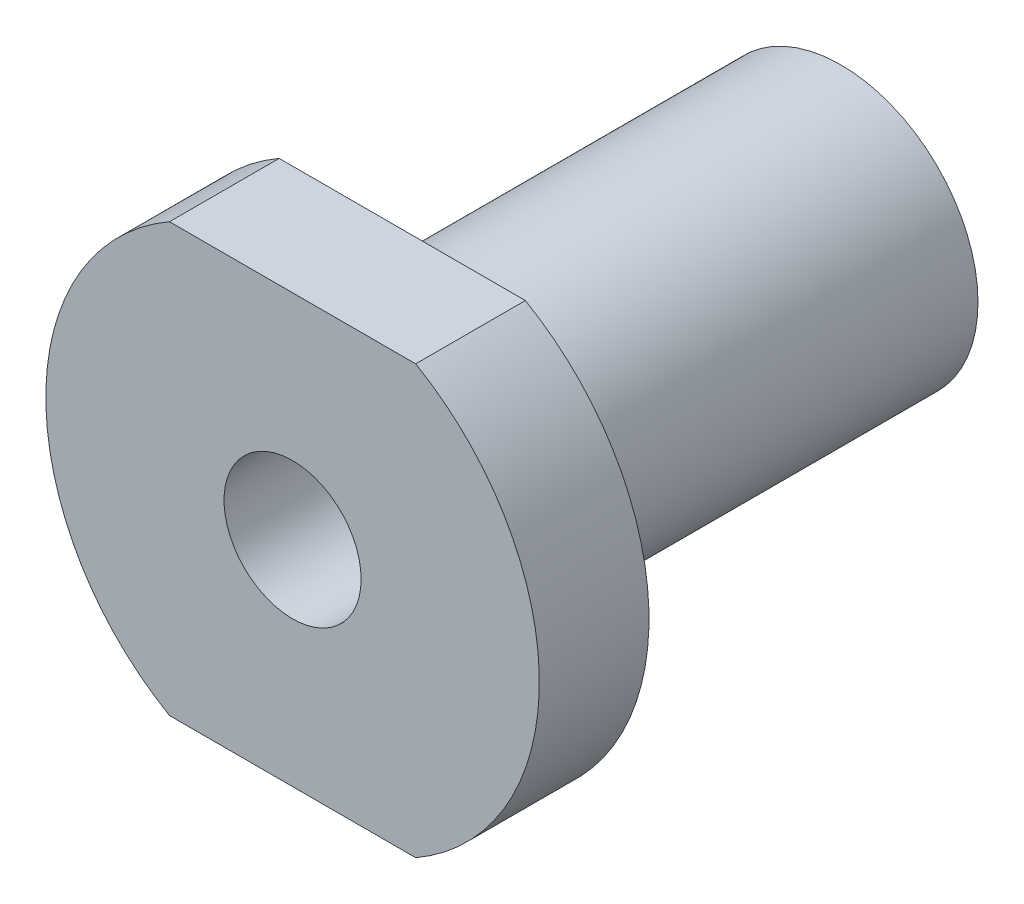
ISO-10303-21;
HEADER;
FILE_DESCRIPTION(('STEP AP214'),'2;1');
FILE_NAME('part.step','',(''),(''),'','','');
FILE_SCHEMA(('AUTOMOTIVE_DESIGN { 1 0 10303 214 1 1 1 1 }'));
ENDSEC;
DATA;
#1=APPLICATION_CONTEXT('core data for automotive mechanical design processes');
#2=APPLICATION_PROTOCOL_DEFINITION('international standard','automotive_design',2000,#1);
#3=PRODUCT_CONTEXT('',#1,'mechanical');
#4=PRODUCT('Part','Part','',(#3));
#5=PRODUCT_RELATED_PRODUCT_CATEGORY('part','',(#4));
#6=PRODUCT_DEFINITION_FORMATION('','',#4);
#7=PRODUCT_DEFINITION_CONTEXT('part definition',#1,'design');
#8=PRODUCT_DEFINITION('design','',#6,#7);
#9=PRODUCT_DEFINITION_SHAPE('','',#8);
#10=(LENGTH_UNIT() NAMED_UNIT(*) SI_UNIT(.MILLI.,.METRE.));
#11=(NAMED_UNIT(*) PLANE_ANGLE_UNIT() SI_UNIT($,.RADIAN.));
#12=(NAMED_UNIT(*) SI_UNIT($,.STERADIAN.) SOLID_ANGLE_UNIT());
#13=UNCERTAINTY_MEASURE_WITH_UNIT(LENGTH_MEASURE(1.E-05),#10,'distance_accuracy_value','');
#14=(GEOMETRIC_REPRESENTATION_CONTEXT(3) GLOBAL_UNCERTAINTY_ASSIGNED_CONTEXT((#13)) GLOBAL_UNIT_ASSIGNED_CONTEXT((#10,
#11,#12)) REPRESENTATION_CONTEXT('',''));
#15=CARTESIAN_POINT('',(0.,0.,0.));
#16=DIRECTION('',(0.,0.,1.));
#17=DIRECTION('',(1.,0.,0.));
#18=AXIS2_PLACEMENT_3D('',#15,#16,#17);
#19=CARTESIAN_POINT('',(0.,0.,2.));
#20=DIRECTION('',(0.,0.,0.999999999999999));
#21=DIRECTION('',(1.,0.,0.));
#22=AXIS2_PLACEMENT_3D('',#19,#20,#21);
#23=PLANE('',#22);
#24=CARTESIAN_POINT('',(0.,0.,2.));
#25=DIRECTION('',(0.,0.,0.999999999999999));
#26=DIRECTION('',(1.,0.,0.));
#27=AXIS2_PLACEMENT_3D('',#24,#25,#26);
#28=CIRCLE('',#27,1.25);
#29=CARTESIAN_POINT('',(1.25,0.,2.));
#30=VERTEX_POINT('',#29);
#31=EDGE_CURVE('E112',#30,#30,#28,.T.);
#32=ORIENTED_EDGE('',*,*,#31,.F.);
#33=EDGE_LOOP('',(#32));
#34=FACE_BOUND('',#33,.T.);
#35=CARTESIAN_POINT('',(0.,0.,2.));
#36=DIRECTION('',(0.,0.,0.999999999999999));
#37=DIRECTION('',(1.,0.,0.));
#38=AXIS2_PLACEMENT_3D('',#35,#36,#37);
#39=CIRCLE('',#38,4.5);
#40=CARTESIAN_POINT('',(-2.24499443206436,3.89999999999997,2.));
#41=VERTEX_POINT('',#40);
#42=CARTESIAN_POINT('',(-2.24499443206437,-3.90000000000003,2.));
#43=VERTEX_POINT('',#42);
#44=EDGE_CURVE('E94',#41,#43,#39,.T.);
#45=ORIENTED_EDGE('',*,*,#44,.T.);
#46=DIRECTION('',(1.,0.,0.));
#47=VECTOR('',#46,1.);
#48=CARTESIAN_POINT('',(-5.50000000000001,-3.9,2.));
#49=LINE('',#48,#47);
#50=CARTESIAN_POINT('',(2.24499443206437,-3.9,2.));
#51=VERTEX_POINT('',#50);
#52=EDGE_CURVE('E83',#43,#51,#49,.T.);
#53=ORIENTED_EDGE('',*,*,#52,.T.);
#54=CARTESIAN_POINT('',(2.24499443206438,3.90000000000001,2.));
#55=VERTEX_POINT('',#54);
#56=EDGE_CURVE('E89',#51,#55,#39,.T.);
#57=ORIENTED_EDGE('',*,*,#56,.T.);
#58=DIRECTION('',(-1.,0.,0.));
#59=VECTOR('',#58,1.);
#60=CARTESIAN_POINT('',(-5.50000000000001,3.89999999999999,2.));
#61=LINE('',#60,#59);
#62=EDGE_CURVE('E74',#55,#41,#61,.T.);
#63=ORIENTED_EDGE('',*,*,#62,.T.);
#64=EDGE_LOOP('',(#45,#53,#57,#63));
#65=FACE_BOUND('',#64,.T.);
#66=ADVANCED_FACE('F36',(#34,#65),#23,.T.);
#67=CARTESIAN_POINT('',(0.,0.,0.));
#68=DIRECTION('',(0.,0.,0.999999999999999));
#69=DIRECTION('',(1.,0.,0.));
#70=AXIS2_PLACEMENT_3D('',#67,#68,#69);
#71=PLANE('',#70);
#72=CARTESIAN_POINT('',(0.,0.,0.));
#73=DIRECTION('',(0.,0.,0.999999999999999));
#74=DIRECTION('',(1.,0.,0.));
#75=AXIS2_PLACEMENT_3D('',#72,#73,#74);
#76=CIRCLE('',#75,2.5);
#77=CARTESIAN_POINT('',(2.5,0.,0.));
#78=VERTEX_POINT('',#77);
#79=EDGE_CURVE('E103',#78,#78,#76,.T.);
#80=ORIENTED_EDGE('',*,*,#79,.T.);
#81=EDGE_LOOP('',(#80));
#82=FACE_BOUND('',#81,.T.);
#83=DIRECTION('',(1.,0.,0.));
#84=VECTOR('',#83,1.);
#85=CARTESIAN_POINT('',(0.,-3.9,0.));
#86=LINE('',#85,#84);
#87=CARTESIAN_POINT('',(-2.24499443206437,-3.90000000000003,0.));
#88=VERTEX_POINT('',#87);
#89=CARTESIAN_POINT('',(2.24499443206437,-3.9,0.));
#90=VERTEX_POINT('',#89);
#91=EDGE_CURVE('E50',#88,#90,#86,.T.);
#92=ORIENTED_EDGE('',*,*,#91,.F.);
#93=CARTESIAN_POINT('',(0.,0.,0.));
#94=DIRECTION('',(0.,0.,0.999999999999999));
#95=DIRECTION('',(1.,0.,0.));
#96=AXIS2_PLACEMENT_3D('',#93,#94,#95);
#97=CIRCLE('',#96,4.5);
#98=CARTESIAN_POINT('',(-2.24499443206436,3.89999999999997,0.));
#99=VERTEX_POINT('',#98);
#100=EDGE_CURVE('E95',#99,#88,#97,.T.);
#101=ORIENTED_EDGE('',*,*,#100,.F.);
#102=DIRECTION('',(-1.,0.,0.));
#103=VECTOR('',#102,1.);
#104=CARTESIAN_POINT('',(0.,3.9,0.));
#105=LINE('',#104,#103);
#106=CARTESIAN_POINT('',(2.24499443206438,3.90000000000001,0.));
#107=VERTEX_POINT('',#106);
#108=EDGE_CURVE('E58',#107,#99,#105,.T.);
#109=ORIENTED_EDGE('',*,*,#108,.F.);
#110=EDGE_CURVE('E91',#90,#107,#97,.T.);
#111=ORIENTED_EDGE('',*,*,#110,.F.);
#112=EDGE_LOOP('',(#92,#101,#109,#111));
#113=FACE_BOUND('',#112,.T.);
#114=ADVANCED_FACE('F109',(#82,#113),#71,.F.);
#115=CARTESIAN_POINT('',(0.,0.,2.));
#116=DIRECTION('',(0.,0.,-0.999999999999999));
#117=DIRECTION('',(-1.,0.,0.));
#118=AXIS2_PLACEMENT_3D('',#115,#116,#117);
#119=CYLINDRICAL_SURFACE('',#118,4.5);
#120=DIRECTION('',(0.,0.,-0.999999999999999));
#121=VECTOR('',#120,1.);
#122=CARTESIAN_POINT('',(-2.24499443206437,-3.90000000000003,2.));
#123=LINE('',#122,#121);
#124=EDGE_CURVE('E11',#43,#88,#123,.T.);
#125=ORIENTED_EDGE('',*,*,#124,.F.);
#126=ORIENTED_EDGE('',*,*,#44,.F.);
#127=DIRECTION('',(0.,0.,-0.999999999999999));
#128=VECTOR('',#127,1.);
#129=CARTESIAN_POINT('',(-2.24499443206436,3.89999999999997,2.));
#130=LINE('',#129,#128);
#131=EDGE_CURVE('E78',#99,#41,#130,.F.);
#132=ORIENTED_EDGE('',*,*,#131,.F.);
#133=ORIENTED_EDGE('',*,*,#100,.T.);
#134=EDGE_LOOP('',(#125,#126,#132,#133));
#135=FACE_BOUND('',#134,.T.);
#136=ADVANCED_FACE('F38',(#135),#119,.T.);
#137=DIRECTION('',(0.,0.,-0.999999999999999));
#138=VECTOR('',#137,1.);
#139=CARTESIAN_POINT('',(2.24499443206437,-3.9,2.));
#140=LINE('',#139,#138);
#141=EDGE_CURVE('E44',#90,#51,#140,.F.);
#142=ORIENTED_EDGE('',*,*,#141,.F.);
#143=ORIENTED_EDGE('',*,*,#110,.T.);
#144=DIRECTION('',(0.,0.,-0.999999999999999));
#145=VECTOR('',#144,1.);
#146=CARTESIAN_POINT('',(2.24499443206438,3.90000000000001,2.));
#147=LINE('',#146,#145);
#148=EDGE_CURVE('E77',#55,#107,#147,.T.);
#149=ORIENTED_EDGE('',*,*,#148,.F.);
#150=ORIENTED_EDGE('',*,*,#56,.F.);
#151=EDGE_LOOP('',(#142,#143,#149,#150));
#152=FACE_BOUND('',#151,.T.);
#153=ADVANCED_FACE('F88',(#152),#119,.T.);
#154=CARTESIAN_POINT('',(0.,0.,-8.));
#155=DIRECTION('',(0.,0.,0.999999999999999));
#156=DIRECTION('',(1.,0.,0.));
#157=AXIS2_PLACEMENT_3D('',#154,#155,#156);
#158=CYLINDRICAL_SURFACE('',#157,2.5);
#159=CARTESIAN_POINT('',(0.,0.,-8.));
#160=DIRECTION('',(0.,0.,0.999999999999999));
#161=DIRECTION('',(1.,0.,0.));
#162=AXIS2_PLACEMENT_3D('',#159,#160,#161);
#163=CIRCLE('',#162,2.5);
#164=CARTESIAN_POINT('',(2.5,0.,-8.));
#165=VERTEX_POINT('',#164);
#166=EDGE_CURVE('E100',#165,#165,#163,.T.);
#167=CARTESIAN_POINT('',(2.5,0.,-8.));
#168=CARTESIAN_POINT('',(2.5,0.,-7.91666666666667));
#169=CARTESIAN_POINT('',(2.5,0.,-7.83333333333333));
#170=CARTESIAN_POINT('',(2.5,0.,-7.66666666666667));
#171=CARTESIAN_POINT('',(2.5,0.,-7.58333333333333));
#172=CARTESIAN_POINT('',(2.5,0.,-7.41666666666667));
#173=CARTESIAN_POINT('',(2.5,0.,-7.33333333333333));
#174=CARTESIAN_POINT('',(2.5,0.,-7.16666666666667));
#175=CARTESIAN_POINT('',(2.5,0.,-7.08333333333333));
#176=CARTESIAN_POINT('',(2.5,0.,-6.91666666666667));
#177=CARTESIAN_POINT('',(2.5,0.,-6.83333333333333));
#178=CARTESIAN_POINT('',(2.5,0.,-6.66666666666667));
#179=CARTESIAN_POINT('',(2.5,0.,-6.58333333333333));
#180=CARTESIAN_POINT('',(2.5,0.,-6.41666666666667));
#181=CARTESIAN_POINT('',(2.5,0.,-6.33333333333333));
#182=CARTESIAN_POINT('',(2.5,0.,-6.16666666666667));
#183=CARTESIAN_POINT('',(2.5,0.,-6.08333333333333));
#184=CARTESIAN_POINT('',(2.5,0.,-5.91666666666667));
#185=CARTESIAN_POINT('',(2.5,0.,-5.83333333333333));
#186=CARTESIAN_POINT('',(2.5,0.,-5.66666666666667));
#187=CARTESIAN_POINT('',(2.5,0.,-5.58333333333333));
#188=CARTESIAN_POINT('',(2.5,0.,-5.41666666666667));
#189=CARTESIAN_POINT('',(2.5,0.,-5.33333333333333));
#190=CARTESIAN_POINT('',(2.5,0.,-5.16666666666667));
#191=CARTESIAN_POINT('',(2.5,0.,-5.08333333333333));
#192=CARTESIAN_POINT('',(2.5,0.,-4.91666666666667));
#193=CARTESIAN_POINT('',(2.5,0.,-4.83333333333333));
#194=CARTESIAN_POINT('',(2.5,0.,-4.66666666666667));
#195=CARTESIAN_POINT('',(2.5,0.,-4.58333333333333));
#196=CARTESIAN_POINT('',(2.5,0.,-4.41666666666667));
#197=CARTESIAN_POINT('',(2.5,0.,-4.33333333333333));
#198=CARTESIAN_POINT('',(2.5,0.,-4.16666666666667));
#199=CARTESIAN_POINT('',(2.5,0.,-4.08333333333333));
#200=CARTESIAN_POINT('',(2.5,0.,-3.91666666666667));
#201=CARTESIAN_POINT('',(2.5,0.,-3.83333333333333));
#202=CARTESIAN_POINT('',(2.5,0.,-3.66666666666667));
#203=CARTESIAN_POINT('',(2.5,0.,-3.58333333333333));
#204=CARTESIAN_POINT('',(2.5,0.,-3.41666666666667));
#205=CARTESIAN_POINT('',(2.5,0.,-3.33333333333333));
#206=CARTESIAN_POINT('',(2.5,0.,-3.16666666666667));
#207=CARTESIAN_POINT('',(2.5,0.,-3.08333333333333));
#208=CARTESIAN_POINT('',(2.5,0.,-2.91666666666667));
#209=CARTESIAN_POINT('',(2.5,0.,-2.83333333333333));
#210=CARTESIAN_POINT('',(2.5,0.,-2.66666666666667));
#211=CARTESIAN_POINT('',(2.5,0.,-2.58333333333333));
#212=CARTESIAN_POINT('',(2.5,0.,-2.41666666666667));
#213=CARTESIAN_POINT('',(2.5,0.,-2.33333333333333));
#214=CARTESIAN_POINT('',(2.5,0.,-2.16666666666667));
#215=CARTESIAN_POINT('',(2.5,0.,-2.08333333333333));
#216=CARTESIAN_POINT('',(2.5,0.,-1.91666666666667));
#217=CARTESIAN_POINT('',(2.5,0.,-1.83333333333333));
#218=CARTESIAN_POINT('',(2.5,0.,-1.66666666666667));
#219=CARTESIAN_POINT('',(2.5,0.,-1.58333333333333));
#220=CARTESIAN_POINT('',(2.5,0.,-1.41666666666667));
#221=CARTESIAN_POINT('',(2.5,0.,-1.33333333333333));
#222=CARTESIAN_POINT('',(2.5,0.,-1.16666666666667));
#223=CARTESIAN_POINT('',(2.5,0.,-1.08333333333333));
#224=CARTESIAN_POINT('',(2.5,0.,-0.916666666666666));
#225=CARTESIAN_POINT('',(2.5,0.,-0.833333333333332));
#226=CARTESIAN_POINT('',(2.5,0.,-0.666666666666666));
#227=CARTESIAN_POINT('',(2.5,0.,-0.583333333333333));
#228=CARTESIAN_POINT('',(2.5,0.,-0.416666666666666));
#229=CARTESIAN_POINT('',(2.5,0.,-0.333333333333333));
#230=CARTESIAN_POINT('',(2.5,0.,-0.166666666666666));
#231=CARTESIAN_POINT('',(2.5,0.,-0.0833333333333331));
#232=CARTESIAN_POINT('',(2.5,0.,0.));
#233=B_SPLINE_CURVE_WITH_KNOTS('',3,(#167,#168,#169,#170,#171,#172,#173,#174,#175,#176,#177,
#178,#179,#180,#181,#182,#183,#184,#185,#186,#187,#188,#189,#190,#191,#192,#193,#194,#195,#196,
#197,#198,#199,#200,#201,#202,#203,#204,#205,#206,#207,#208,#209,#210,#211,#212,#213,#214,#215,
#216,#217,#218,#219,#220,#221,#222,#223,#224,#225,#226,#227,#228,#229,#230,#231,#232),
.UNSPECIFIED.,.F.,.F.,(4,2,2,2,2,2,2,2,2,2,2,2,2,2,2,2,2,2,2,2,2,2,2,2,2,2,2,2,2,2,2,2,4),(0.,
0.250000000000001,0.500000000000001,0.750000000000001,1.,1.25,1.5,1.75,2.,2.25,2.5,2.75,3.,3.25,
3.5,3.75,4.,4.25,4.5,4.75,5.,5.25,5.5,5.75,6.,6.25,6.5,6.75,7.,7.25,7.5,7.75,8.),.UNSPECIFIED.);
#234=EDGE_CURVE('BSEAM130',#165,#78,#233,.T.);
#235=ORIENTED_EDGE('',*,*,#166,.T.);
#236=ORIENTED_EDGE('',*,*,#79,.F.);
#237=ORIENTED_EDGE('',*,*,#234,.T.);
#238=ORIENTED_EDGE('',*,*,#234,.F.);
#239=EDGE_LOOP('',(#235,#237,#236,#238));
#240=FACE_BOUND('',#239,.T.);
#241=ADVANCED_FACE('F130',(#240),#158,.T.);
#242=CARTESIAN_POINT('',(0.,0.,-8.));
#243=DIRECTION('',(0.,0.,0.999999999999999));
#244=DIRECTION('',(1.,0.,0.));
#245=AXIS2_PLACEMENT_3D('',#242,#243,#244);
#246=PLANE('',#245);
#247=CARTESIAN_POINT('',(0.,0.,-8.));
#248=DIRECTION('',(0.,0.,0.999999999999999));
#249=DIRECTION('',(1.,0.,0.));
#250=AXIS2_PLACEMENT_3D('',#247,#248,#249);
#251=CIRCLE('',#250,1.25);
#252=CARTESIAN_POINT('',(1.25,0.,-8.));
#253=VERTEX_POINT('',#252);
#254=EDGE_CURVE('E116',#253,#253,#251,.T.);
#255=ORIENTED_EDGE('',*,*,#254,.T.);
#256=EDGE_LOOP('',(#255));
#257=FACE_BOUND('',#256,.T.);
#258=ORIENTED_EDGE('',*,*,#166,.F.);
#259=EDGE_LOOP('',(#258));
#260=FACE_BOUND('',#259,.T.);
#261=ADVANCED_FACE('F133',(#257,#260),#246,.F.);
#262=CARTESIAN_POINT('',(0.,0.,-8.));
#263=DIRECTION('',(0.,0.,0.999999999999999));
#264=DIRECTION('',(1.,0.,0.));
#265=AXIS2_PLACEMENT_3D('',#262,#263,#264);
#266=CYLINDRICAL_SURFACE('',#265,1.25);
#267=CARTESIAN_POINT('',(1.25,0.,-8.));
#268=CARTESIAN_POINT('',(1.25,0.,-7.89583333333333));
#269=CARTESIAN_POINT('',(1.25,0.,-7.79166666666667));
#270=CARTESIAN_POINT('',(1.25,0.,-7.58333333333333));
#271=CARTESIAN_POINT('',(1.25,0.,-7.47916666666667));
#272=CARTESIAN_POINT('',(1.25,0.,-7.27083333333333));
#273=CARTESIAN_POINT('',(1.25,0.,-7.16666666666667));
#274=CARTESIAN_POINT('',(1.25,0.,-6.95833333333333));
#275=CARTESIAN_POINT('',(1.25,0.,-6.85416666666667));
#276=CARTESIAN_POINT('',(1.25,0.,-6.64583333333333));
#277=CARTESIAN_POINT('',(1.25,0.,-6.54166666666667));
#278=CARTESIAN_POINT('',(1.25,0.,-6.33333333333333));
#279=CARTESIAN_POINT('',(1.25,0.,-6.22916666666667));
#280=CARTESIAN_POINT('',(1.25,0.,-6.02083333333333));
#281=CARTESIAN_POINT('',(1.25,0.,-5.91666666666667));
#282=CARTESIAN_POINT('',(1.25,0.,-5.70833333333333));
#283=CARTESIAN_POINT('',(1.25,0.,-5.60416666666667));
#284=CARTESIAN_POINT('',(1.25,0.,-5.39583333333333));
#285=CARTESIAN_POINT('',(1.25,0.,-5.29166666666667));
#286=CARTESIAN_POINT('',(1.25,0.,-5.08333333333333));
#287=CARTESIAN_POINT('',(1.25,0.,-4.97916666666667));
#288=CARTESIAN_POINT('',(1.25,0.,-4.77083333333333));
#289=CARTESIAN_POINT('',(1.25,0.,-4.66666666666667));
#290=CARTESIAN_POINT('',(1.25,0.,-4.45833333333333));
#291=CARTESIAN_POINT('',(1.25,0.,-4.35416666666667));
#292=CARTESIAN_POINT('',(1.25,0.,-4.14583333333333));
#293=CARTESIAN_POINT('',(1.25,0.,-4.04166666666667));
#294=CARTESIAN_POINT('',(1.25,0.,-3.83333333333333));
#295=CARTESIAN_POINT('',(1.25,0.,-3.72916666666667));
#296=CARTESIAN_POINT('',(1.25,0.,-3.52083333333333));
#297=CARTESIAN_POINT('',(1.25,0.,-3.41666666666667));
#298=CARTESIAN_POINT('',(1.25,0.,-3.20833333333333));
#299=CARTESIAN_POINT('',(1.25,0.,-3.10416666666667));
#300=CARTESIAN_POINT('',(1.25,0.,-2.89583333333333));
#301=CARTESIAN_POINT('',(1.25,0.,-2.79166666666667));
#302=CARTESIAN_POINT('',(1.25,0.,-2.58333333333333));
#303=CARTESIAN_POINT('',(1.25,0.,-2.47916666666667));
#304=CARTESIAN_POINT('',(1.25,0.,-2.27083333333333));
#305=CARTESIAN_POINT('',(1.25,0.,-2.16666666666667));
#306=CARTESIAN_POINT('',(1.25,0.,-1.95833333333333));
#307=CARTESIAN_POINT('',(1.25,0.,-1.85416666666667));
#308=CARTESIAN_POINT('',(1.25,0.,-1.64583333333333));
#309=CARTESIAN_POINT('',(1.25,0.,-1.54166666666667));
#310=CARTESIAN_POINT('',(1.25,0.,-1.33333333333333));
#311=CARTESIAN_POINT('',(1.25,0.,-1.22916666666667));
#312=CARTESIAN_POINT('',(1.25,0.,-1.02083333333333));
#313=CARTESIAN_POINT('',(1.25,0.,-0.916666666666667));
#314=CARTESIAN_POINT('',(1.25,0.,-0.708333333333333));
#315=CARTESIAN_POINT('',(1.25,0.,-0.604166666666666));
#316=CARTESIAN_POINT('',(1.25,0.,-0.395833333333333));
#317=CARTESIAN_POINT('',(1.25,0.,-0.291666666666667));
#318=CARTESIAN_POINT('',(1.25,0.,-0.0833333333333334));
#319=CARTESIAN_POINT('',(1.25,0.,0.0208333333333334));
#320=CARTESIAN_POINT('',(1.25,0.,0.229166666666667));
#321=CARTESIAN_POINT('',(1.25,0.,0.333333333333334));
#322=CARTESIAN_POINT('',(1.25,0.,0.541666666666667));
#323=CARTESIAN_POINT('',(1.25,0.,0.645833333333334));
#324=CARTESIAN_POINT('',(1.25,0.,0.854166666666667));
#325=CARTESIAN_POINT('',(1.25,0.,0.958333333333333));
#326=CARTESIAN_POINT('',(1.25,0.,1.16666666666667));
#327=CARTESIAN_POINT('',(1.25,0.,1.27083333333333));
#328=CARTESIAN_POINT('',(1.25,0.,1.47916666666667));
#329=CARTESIAN_POINT('',(1.25,0.,1.58333333333333));
#330=CARTESIAN_POINT('',(1.25,0.,1.79166666666667));
#331=CARTESIAN_POINT('',(1.25,0.,1.89583333333333));
#332=CARTESIAN_POINT('',(1.25,0.,2.));
#333=B_SPLINE_CURVE_WITH_KNOTS('',3,(#267,#268,#269,#270,#271,#272,#273,#274,#275,#276,#277,
#278,#279,#280,#281,#282,#283,#284,#285,#286,#287,#288,#289,#290,#291,#292,#293,#294,#295,#296,
#297,#298,#299,#300,#301,#302,#303,#304,#305,#306,#307,#308,#309,#310,#311,#312,#313,#314,#315,
#316,#317,#318,#319,#320,#321,#322,#323,#324,#325,#326,#327,#328,#329,#330,#331,#332),
.UNSPECIFIED.,.F.,.F.,(4,2,2,2,2,2,2,2,2,2,2,2,2,2,2,2,2,2,2,2,2,2,2,2,2,2,2,2,2,2,2,2,4),(0.,
0.312500000000001,0.625000000000001,0.937500000000001,1.25,1.5625,1.875,2.1875,2.5,2.8125,3.125,
3.4375,3.75,4.0625,4.375,4.6875,5.,5.3125,5.625,5.9375,6.25,6.5625,6.875,7.1875,7.5,7.8125,
8.125,8.4375,8.75,9.0625,9.375,9.6875,10.),.UNSPECIFIED.);
#334=EDGE_CURVE('BSEAM121',#253,#30,#333,.T.);
#335=ORIENTED_EDGE('',*,*,#254,.F.);
#336=ORIENTED_EDGE('',*,*,#31,.T.);
#337=ORIENTED_EDGE('',*,*,#334,.T.);
#338=ORIENTED_EDGE('',*,*,#334,.F.);
#339=EDGE_LOOP('',(#335,#337,#336,#338));
#340=FACE_BOUND('',#339,.T.);
#341=ADVANCED_FACE('F121',(#340),#266,.F.);
#342=CARTESIAN_POINT('',(-5.50000000000001,3.9,-8.));
#343=DIRECTION('',(0.,1.,0.));
#344=DIRECTION('',(0.,0.,0.999999999999999));
#345=AXIS2_PLACEMENT_3D('',#342,#343,#344);
#346=PLANE('',#345);
#347=ORIENTED_EDGE('',*,*,#148,.T.);
#348=ORIENTED_EDGE('',*,*,#108,.T.);
#349=ORIENTED_EDGE('',*,*,#131,.T.);
#350=ORIENTED_EDGE('',*,*,#62,.F.);
#351=EDGE_LOOP('',(#347,#348,#349,#350));
#352=FACE_BOUND('',#351,.T.);
#353=ADVANCED_FACE('F76',(#352),#346,.T.);
#354=CARTESIAN_POINT('',(-5.50000000000001,-3.90000000000001,-8.));
#355=DIRECTION('',(0.,-1.,0.));
#356=DIRECTION('',(0.,0.,-0.999999999999999));
#357=AXIS2_PLACEMENT_3D('',#354,#355,#356);
#358=PLANE('',#357);
#359=ORIENTED_EDGE('',*,*,#124,.T.);
#360=ORIENTED_EDGE('',*,*,#91,.T.);
#361=ORIENTED_EDGE('',*,*,#141,.T.);
#362=ORIENTED_EDGE('',*,*,#52,.F.);
#363=EDGE_LOOP('',(#359,#360,#361,#362));
#364=FACE_BOUND('',#363,.T.);
#365=ADVANCED_FACE('F106',(#364),#358,.T.);
#366=CLOSED_SHELL('',(#66,#114,#136,#153,#241,#261,#341,#353,#365));
#367=MANIFOLD_SOLID_BREP('B2',#366);
#368=ADVANCED_BREP_SHAPE_REPRESENTATION('',(#18,#367),#14);
#369=SHAPE_DEFINITION_REPRESENTATION(#9,#368);
ENDSEC;
END-ISO-10303-21;
